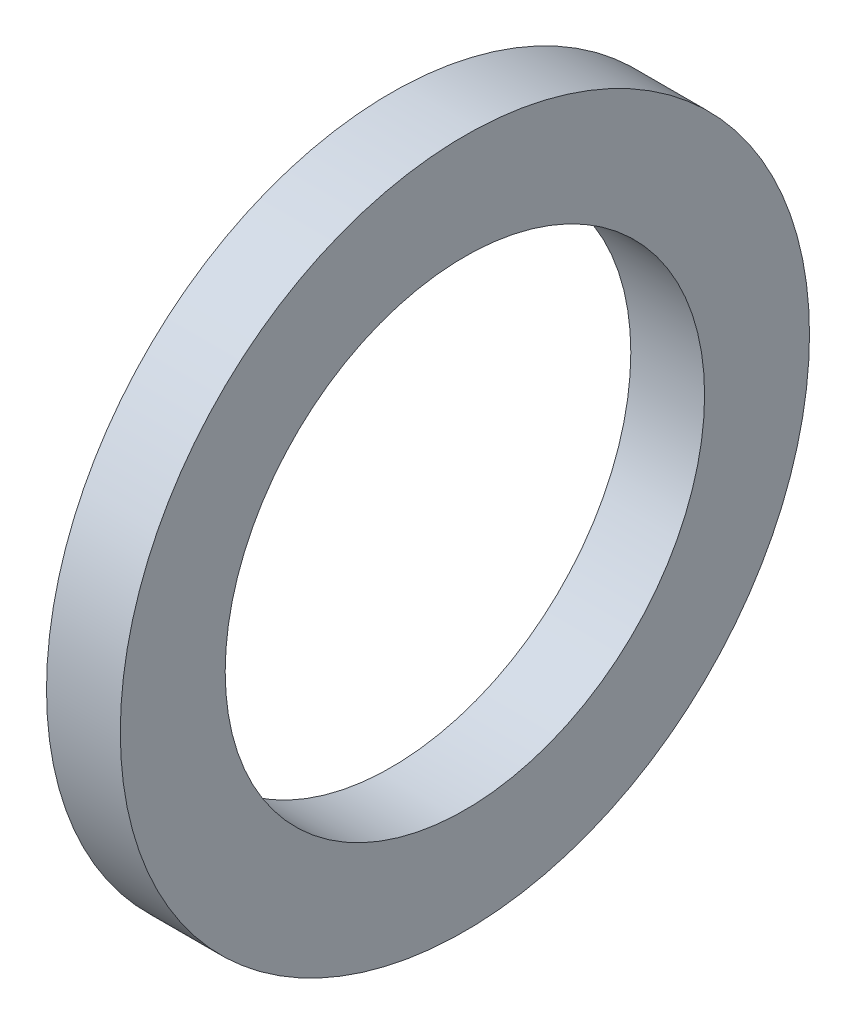
ISO-10303-21;
HEADER;
FILE_DESCRIPTION(('STEP AP214'),'2;1');
FILE_NAME('part.step','',(''),(''),'','','');
FILE_SCHEMA(('AUTOMOTIVE_DESIGN { 1 0 10303 214 1 1 1 1 }'));
ENDSEC;
DATA;
#1=APPLICATION_CONTEXT('core data for automotive mechanical design processes');
#2=APPLICATION_PROTOCOL_DEFINITION('international standard','automotive_design',2000,#1);
#3=PRODUCT_CONTEXT('',#1,'mechanical');
#4=PRODUCT('Part','Part','',(#3));
#5=PRODUCT_RELATED_PRODUCT_CATEGORY('part','',(#4));
#6=PRODUCT_DEFINITION_FORMATION('','',#4);
#7=PRODUCT_DEFINITION_CONTEXT('part definition',#1,'design');
#8=PRODUCT_DEFINITION('design','',#6,#7);
#9=PRODUCT_DEFINITION_SHAPE('','',#8);
#10=(LENGTH_UNIT() NAMED_UNIT(*) SI_UNIT(.MILLI.,.METRE.));
#11=(NAMED_UNIT(*) PLANE_ANGLE_UNIT() SI_UNIT($,.RADIAN.));
#12=(NAMED_UNIT(*) SI_UNIT($,.STERADIAN.) SOLID_ANGLE_UNIT());
#13=UNCERTAINTY_MEASURE_WITH_UNIT(LENGTH_MEASURE(1.E-05),#10,'distance_accuracy_value','');
#14=(GEOMETRIC_REPRESENTATION_CONTEXT(3) GLOBAL_UNCERTAINTY_ASSIGNED_CONTEXT((#13)) GLOBAL_UNIT_ASSIGNED_CONTEXT((#10,
#11,#12)) REPRESENTATION_CONTEXT('',''));
#15=CARTESIAN_POINT('',(0.,0.,0.));
#16=DIRECTION('',(0.,0.,1.));
#17=DIRECTION('',(1.,0.,0.));
#18=AXIS2_PLACEMENT_3D('',#15,#16,#17);
#19=CARTESIAN_POINT('',(0.,0.,0.));
#20=DIRECTION('',(-1.,0.,0.));
#21=DIRECTION('',(0.,0.,1.));
#22=AXIS2_PLACEMENT_3D('',#19,#20,#21);
#23=CYLINDRICAL_SURFACE('',#22,19.2425345581873);
#24=CARTESIAN_POINT('',(0.,0.,0.));
#25=DIRECTION('',(-1.,0.,0.));
#26=DIRECTION('',(0.,0.,1.));
#27=AXIS2_PLACEMENT_3D('',#24,#25,#26);
#28=CIRCLE('',#27,19.2425345581872);
#29=CARTESIAN_POINT('',(0.,0.,19.2425345581872));
#30=VERTEX_POINT('',#29);
#31=EDGE_CURVE('E10',#30,#30,#28,.T.);
#32=ORIENTED_EDGE('',*,*,#31,.F.);
#33=EDGE_LOOP('',(#32));
#34=FACE_BOUND('',#33,.T.);
#35=CARTESIAN_POINT('',(4.12011322270644,0.,0.));
#36=DIRECTION('',(-1.,0.,0.));
#37=DIRECTION('',(0.,0.,1.));
#38=AXIS2_PLACEMENT_3D('',#35,#36,#37);
#39=CIRCLE('',#38,19.2425345581873);
#40=CARTESIAN_POINT('',(4.12011322270637,0.,19.2425345581873));
#41=VERTEX_POINT('',#40);
#42=EDGE_CURVE('E44',#41,#41,#39,.T.);
#43=ORIENTED_EDGE('',*,*,#42,.T.);
#44=EDGE_LOOP('',(#43));
#45=FACE_BOUND('',#44,.T.);
#46=ADVANCED_FACE('F30',(#34,#45),#23,.T.);
#47=CARTESIAN_POINT('',(0.,0.,-19.2425345581872));
#48=DIRECTION('',(1.,0.,0.));
#49=DIRECTION('',(0.,0.,-1.));
#50=AXIS2_PLACEMENT_3D('',#47,#48,#49);
#51=PLANE('',#50);
#52=CARTESIAN_POINT('',(0.,0.,0.));
#53=DIRECTION('',(-1.,0.,0.));
#54=DIRECTION('',(0.,0.,1.));
#55=AXIS2_PLACEMENT_3D('',#52,#53,#54);
#56=CIRCLE('',#55,13.385193972514);
#57=CARTESIAN_POINT('',(0.,0.,13.385193972514));
#58=VERTEX_POINT('',#57);
#59=EDGE_CURVE('E36',#58,#58,#56,.T.);
#60=ORIENTED_EDGE('',*,*,#59,.F.);
#61=EDGE_LOOP('',(#60));
#62=FACE_BOUND('',#61,.T.);
#63=ORIENTED_EDGE('',*,*,#31,.T.);
#64=EDGE_LOOP('',(#63));
#65=FACE_BOUND('',#64,.T.);
#66=ADVANCED_FACE('F59',(#62,#65),#51,.F.);
#67=CARTESIAN_POINT('',(0.,0.,0.));
#68=DIRECTION('',(-1.,0.,0.));
#69=DIRECTION('',(0.,0.,1.));
#70=AXIS2_PLACEMENT_3D('',#67,#68,#69);
#71=CYLINDRICAL_SURFACE('',#70,13.385193972514);
#72=CARTESIAN_POINT('',(4.12011322270646,0.,0.));
#73=DIRECTION('',(-1.,0.,0.));
#74=DIRECTION('',(0.,0.,1.));
#75=AXIS2_PLACEMENT_3D('',#72,#73,#74);
#76=CIRCLE('',#75,13.385193972514);
#77=CARTESIAN_POINT('',(4.12011322270641,0.,13.385193972514));
#78=VERTEX_POINT('',#77);
#79=EDGE_CURVE('E40',#78,#78,#76,.T.);
#80=ORIENTED_EDGE('',*,*,#79,.F.);
#81=EDGE_LOOP('',(#80));
#82=FACE_BOUND('',#81,.T.);
#83=ORIENTED_EDGE('',*,*,#59,.T.);
#84=EDGE_LOOP('',(#83));
#85=FACE_BOUND('',#84,.T.);
#86=ADVANCED_FACE('F54',(#82,#85),#71,.F.);
#87=CARTESIAN_POINT('',(4.12011322270649,0.,-13.385193972514));
#88=DIRECTION('',(-1.,0.,0.));
#89=DIRECTION('',(0.,0.,1.));
#90=AXIS2_PLACEMENT_3D('',#87,#88,#89);
#91=PLANE('',#90);
#92=ORIENTED_EDGE('',*,*,#42,.F.);
#93=EDGE_LOOP('',(#92));
#94=FACE_BOUND('',#93,.T.);
#95=ORIENTED_EDGE('',*,*,#79,.T.);
#96=EDGE_LOOP('',(#95));
#97=FACE_BOUND('',#96,.T.);
#98=ADVANCED_FACE('F51',(#94,#97),#91,.F.);
#99=CLOSED_SHELL('',(#46,#66,#86,#98));
#100=MANIFOLD_SOLID_BREP('B2',#99);
#101=ADVANCED_BREP_SHAPE_REPRESENTATION('',(#18,#100),#14);
#102=SHAPE_DEFINITION_REPRESENTATION(#9,#101);
ENDSEC;
END-ISO-10303-21;
